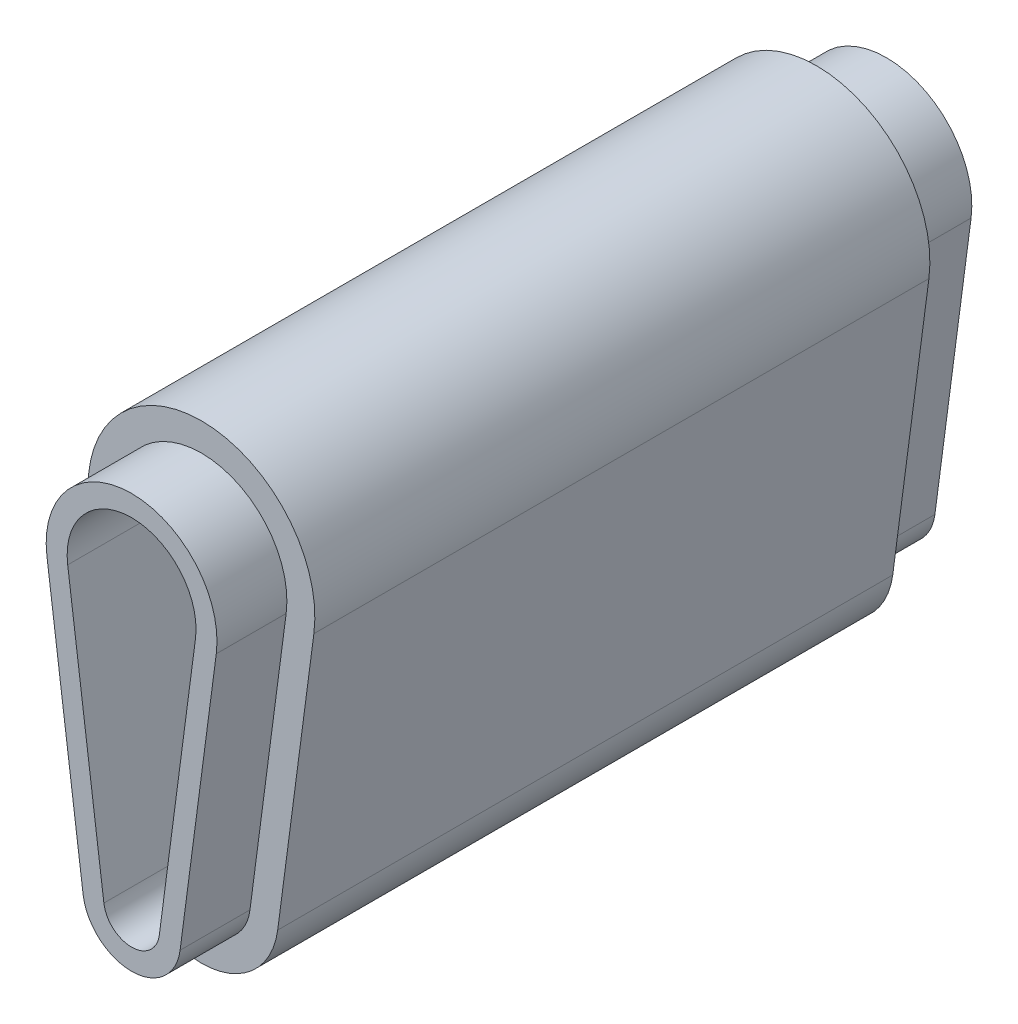
ISO-10303-21;
HEADER;
FILE_DESCRIPTION(('STEP AP214'),'2;1');
FILE_NAME('part.step','',(''),(''),'','','');
FILE_SCHEMA(('AUTOMOTIVE_DESIGN { 1 0 10303 214 1 1 1 1 }'));
ENDSEC;
DATA;
#1=APPLICATION_CONTEXT('core data for automotive mechanical design processes');
#2=APPLICATION_PROTOCOL_DEFINITION('international standard','automotive_design',2000,#1);
#3=PRODUCT_CONTEXT('',#1,'mechanical');
#4=PRODUCT('Part','Part','',(#3));
#5=PRODUCT_RELATED_PRODUCT_CATEGORY('part','',(#4));
#6=PRODUCT_DEFINITION_FORMATION('','',#4);
#7=PRODUCT_DEFINITION_CONTEXT('part definition',#1,'design');
#8=PRODUCT_DEFINITION('design','',#6,#7);
#9=PRODUCT_DEFINITION_SHAPE('','',#8);
#10=(LENGTH_UNIT() NAMED_UNIT(*) SI_UNIT(.MILLI.,.METRE.));
#11=(NAMED_UNIT(*) PLANE_ANGLE_UNIT() SI_UNIT($,.RADIAN.));
#12=(NAMED_UNIT(*) SI_UNIT($,.STERADIAN.) SOLID_ANGLE_UNIT());
#13=UNCERTAINTY_MEASURE_WITH_UNIT(LENGTH_MEASURE(1.E-05),#10,'distance_accuracy_value','');
#14=(GEOMETRIC_REPRESENTATION_CONTEXT(3) GLOBAL_UNCERTAINTY_ASSIGNED_CONTEXT((#13)) GLOBAL_UNIT_ASSIGNED_CONTEXT((#10,
#11,#12)) REPRESENTATION_CONTEXT('',''));
#15=CARTESIAN_POINT('',(0.,0.,0.));
#16=DIRECTION('',(0.,0.,1.));
#17=DIRECTION('',(1.,0.,0.));
#18=AXIS2_PLACEMENT_3D('',#15,#16,#17);
#19=CARTESIAN_POINT('',(0.,99.2950857179196,-22.));
#20=DIRECTION('',(0.,0.,-1.));
#21=DIRECTION('',(-1.,0.,0.));
#22=AXIS2_PLACEMENT_3D('',#19,#20,#21);
#23=PLANE('',#22);
#24=CARTESIAN_POINT('',(0.,99.2950857179196,-22.));
#25=DIRECTION('',(0.,0.,-1.));
#26=DIRECTION('',(-1.,0.,0.));
#27=AXIS2_PLACEMENT_3D('',#24,#25,#26);
#28=CIRCLE('',#27,2.75);
#29=CARTESIAN_POINT('',(2.72647336877798,98.9361386893145,-22.));
#30=VERTEX_POINT('',#29);
#31=CARTESIAN_POINT('',(-2.72647336877798,98.9361386893145,-22.));
#32=VERTEX_POINT('',#31);
#33=EDGE_CURVE('E204',#30,#32,#28,.T.);
#34=ORIENTED_EDGE('',*,*,#33,.T.);
#35=DIRECTION('',(-0.130526192220055,0.99144486137381,0.));
#36=VECTOR('',#35,1.);
#37=CARTESIAN_POINT('',(-2.72647336877798,98.9361386893145,-22.));
#38=LINE('',#37,#36);
#39=CARTESIAN_POINT('',(-4.02056859429062,108.76576782076,-22.));
#40=VERTEX_POINT('',#39);
#41=EDGE_CURVE('E207',#32,#40,#38,.T.);
#42=ORIENTED_EDGE('',*,*,#41,.T.);
#43=CARTESIAN_POINT('',(0.,109.29508571792,-22.));
#44=DIRECTION('',(0.,0.,-1.));
#45=DIRECTION('',(-1.,0.,0.));
#46=AXIS2_PLACEMENT_3D('',#43,#44,#45);
#47=CIRCLE('',#46,4.05526192220055);
#48=CARTESIAN_POINT('',(4.02056859429061,108.76576782076,-22.));
#49=VERTEX_POINT('',#48);
#50=EDGE_CURVE('E210',#40,#49,#47,.T.);
#51=ORIENTED_EDGE('',*,*,#50,.T.);
#52=DIRECTION('',(-0.130526192220055,-0.99144486137381,0.));
#53=VECTOR('',#52,1.);
#54=CARTESIAN_POINT('',(4.02056859429061,108.76576782076,-22.));
#55=LINE('',#54,#53);
#56=EDGE_CURVE('E212',#49,#30,#55,.T.);
#57=ORIENTED_EDGE('',*,*,#56,.T.);
#58=EDGE_LOOP('',(#34,#42,#51,#57));
#59=FACE_BOUND('',#58,.T.);
#60=CARTESIAN_POINT('',(0.,109.29508571792,-22.));
#61=DIRECTION('',(0.,0.,-1.));
#62=DIRECTION('',(-1.,0.,0.));
#63=AXIS2_PLACEMENT_3D('',#60,#61,#62);
#64=CIRCLE('',#63,3.05526192220055);
#65=CARTESIAN_POINT('',(-3.02912373291681,108.89629401298,-22.));
#66=VERTEX_POINT('',#65);
#67=CARTESIAN_POINT('',(3.0291237329168,108.89629401298,-22.));
#68=VERTEX_POINT('',#67);
#69=EDGE_CURVE('E190',#66,#68,#64,.T.);
#70=ORIENTED_EDGE('',*,*,#69,.F.);
#71=DIRECTION('',(-0.130526192220055,0.99144486137381,0.));
#72=VECTOR('',#71,1.);
#73=CARTESIAN_POINT('',(-1.73502850740417,99.0666648815345,-22.));
#74=LINE('',#73,#72);
#75=CARTESIAN_POINT('',(-1.73502850740417,99.0666648815345,-22.));
#76=VERTEX_POINT('',#75);
#77=EDGE_CURVE('E176',#76,#66,#74,.T.);
#78=ORIENTED_EDGE('',*,*,#77,.F.);
#79=CARTESIAN_POINT('',(0.,99.2950857179196,-22.));
#80=DIRECTION('',(0.,0.,-1.));
#81=DIRECTION('',(-1.,0.,0.));
#82=AXIS2_PLACEMENT_3D('',#79,#80,#81);
#83=CIRCLE('',#82,1.75);
#84=CARTESIAN_POINT('',(1.73502850740417,99.0666648815345,-22.));
#85=VERTEX_POINT('',#84);
#86=EDGE_CURVE('E181',#85,#76,#83,.T.);
#87=ORIENTED_EDGE('',*,*,#86,.F.);
#88=DIRECTION('',(-0.130526192220055,-0.99144486137381,0.));
#89=VECTOR('',#88,1.);
#90=CARTESIAN_POINT('',(1.73502850740417,99.0666648815345,-22.));
#91=LINE('',#90,#89);
#92=EDGE_CURVE('E192',#68,#85,#91,.T.);
#93=ORIENTED_EDGE('',*,*,#92,.F.);
#94=EDGE_LOOP('',(#70,#78,#87,#93));
#95=FACE_BOUND('',#94,.T.);
#96=ADVANCED_FACE('F32',(#59,#95),#23,.T.);
#97=CARTESIAN_POINT('',(0.,99.2950857179196,0.));
#98=DIRECTION('',(0.,0.,1.));
#99=DIRECTION('',(1.,0.,0.));
#100=AXIS2_PLACEMENT_3D('',#97,#98,#99);
#101=CYLINDRICAL_SURFACE('',#100,1.75);
#102=CARTESIAN_POINT('',(0.,99.2950857179196,2.5));
#103=DIRECTION('',(0.,0.,1.));
#104=DIRECTION('',(1.,0.,0.));
#105=AXIS2_PLACEMENT_3D('',#102,#103,#104);
#106=CIRCLE('',#105,1.75);
#107=CARTESIAN_POINT('',(-1.73502850740417,99.0666648815345,2.5));
#108=VERTEX_POINT('',#107);
#109=CARTESIAN_POINT('',(1.73502850740417,99.0666648815345,2.5));
#110=VERTEX_POINT('',#109);
#111=EDGE_CURVE('E241',#108,#110,#106,.T.);
#112=ORIENTED_EDGE('',*,*,#111,.F.);
#113=DIRECTION('',(0.,0.,1.));
#114=VECTOR('',#113,1.);
#115=CARTESIAN_POINT('',(-1.73502850740417,99.0666648815345,0.));
#116=LINE('',#115,#114);
#117=CARTESIAN_POINT('',(-1.73502850740417,99.0666648815345,0.));
#118=VERTEX_POINT('',#117);
#119=EDGE_CURVE('E11',#118,#108,#116,.T.);
#120=ORIENTED_EDGE('',*,*,#119,.F.);
#121=CARTESIAN_POINT('',(0.,99.2950857179196,0.));
#122=DIRECTION('',(0.,0.,1.));
#123=DIRECTION('',(1.,0.,0.));
#124=AXIS2_PLACEMENT_3D('',#121,#122,#123);
#125=CIRCLE('',#124,1.75);
#126=CARTESIAN_POINT('',(1.73502850740417,99.0666648815345,0.));
#127=VERTEX_POINT('',#126);
#128=EDGE_CURVE('E245',#118,#127,#125,.T.);
#129=ORIENTED_EDGE('',*,*,#128,.T.);
#130=DIRECTION('',(0.,0.,1.));
#131=VECTOR('',#130,1.);
#132=CARTESIAN_POINT('',(1.73502850740417,99.0666648815345,0.));
#133=LINE('',#132,#131);
#134=EDGE_CURVE('E36',#127,#110,#133,.T.);
#135=ORIENTED_EDGE('',*,*,#134,.T.);
#136=EDGE_LOOP('',(#112,#120,#129,#135));
#137=FACE_BOUND('',#136,.T.);
#138=ADVANCED_FACE('F34',(#137),#101,.T.);
#139=CARTESIAN_POINT('',(-3.02912373291681,108.89629401298,0.));
#140=DIRECTION('',(-0.99144486137381,-0.130526192220055,0.));
#141=DIRECTION('',(0.130526192220055,-0.99144486137381,0.));
#142=AXIS2_PLACEMENT_3D('',#139,#140,#141);
#143=PLANE('',#142);
#144=DIRECTION('',(0.130526192220055,-0.99144486137381,0.));
#145=VECTOR('',#144,1.);
#146=CARTESIAN_POINT('',(-3.02912373291681,108.89629401298,2.5));
#147=LINE('',#146,#145);
#148=CARTESIAN_POINT('',(-3.02912373291681,108.89629401298,2.5));
#149=VERTEX_POINT('',#148);
#150=EDGE_CURVE('E249',#149,#108,#147,.T.);
#151=ORIENTED_EDGE('',*,*,#150,.F.);
#152=DIRECTION('',(0.,0.,1.));
#153=VECTOR('',#152,1.);
#154=CARTESIAN_POINT('',(-3.02912373291681,108.89629401298,0.));
#155=LINE('',#154,#153);
#156=CARTESIAN_POINT('',(-3.02912373291681,108.89629401298,0.));
#157=VERTEX_POINT('',#156);
#158=EDGE_CURVE('E41',#157,#149,#155,.T.);
#159=ORIENTED_EDGE('',*,*,#158,.F.);
#160=DIRECTION('',(0.130526192220055,-0.99144486137381,0.));
#161=VECTOR('',#160,1.);
#162=CARTESIAN_POINT('',(-3.02912373291681,108.89629401298,0.));
#163=LINE('',#162,#161);
#164=EDGE_CURVE('E255',#157,#118,#163,.T.);
#165=ORIENTED_EDGE('',*,*,#164,.T.);
#166=ORIENTED_EDGE('',*,*,#119,.T.);
#167=EDGE_LOOP('',(#151,#159,#165,#166));
#168=FACE_BOUND('',#167,.T.);
#169=ADVANCED_FACE('F283',(#168),#143,.T.);
#170=CARTESIAN_POINT('',(0.,109.29508571792,0.));
#171=DIRECTION('',(0.,0.,1.));
#172=DIRECTION('',(1.,0.,0.));
#173=AXIS2_PLACEMENT_3D('',#170,#171,#172);
#174=CYLINDRICAL_SURFACE('',#173,3.05526192220055);
#175=CARTESIAN_POINT('',(0.,109.29508571792,2.5));
#176=DIRECTION('',(0.,0.,1.));
#177=DIRECTION('',(1.,0.,0.));
#178=AXIS2_PLACEMENT_3D('',#175,#176,#177);
#179=CIRCLE('',#178,3.05526192220055);
#180=CARTESIAN_POINT('',(3.0291237329168,108.89629401298,2.5));
#181=VERTEX_POINT('',#180);
#182=EDGE_CURVE('E263',#181,#149,#179,.T.);
#183=ORIENTED_EDGE('',*,*,#182,.F.);
#184=DIRECTION('',(0.,0.,1.));
#185=VECTOR('',#184,1.);
#186=CARTESIAN_POINT('',(3.0291237329168,108.89629401298,0.));
#187=LINE('',#186,#185);
#188=CARTESIAN_POINT('',(3.0291237329168,108.89629401298,0.));
#189=VERTEX_POINT('',#188);
#190=EDGE_CURVE('E268',#189,#181,#187,.T.);
#191=ORIENTED_EDGE('',*,*,#190,.F.);
#192=CARTESIAN_POINT('',(0.,109.29508571792,0.));
#193=DIRECTION('',(0.,0.,1.));
#194=DIRECTION('',(1.,0.,0.));
#195=AXIS2_PLACEMENT_3D('',#192,#193,#194);
#196=CIRCLE('',#195,3.05526192220055);
#197=EDGE_CURVE('E252',#189,#157,#196,.T.);
#198=ORIENTED_EDGE('',*,*,#197,.T.);
#199=ORIENTED_EDGE('',*,*,#158,.T.);
#200=EDGE_LOOP('',(#183,#191,#198,#199));
#201=FACE_BOUND('',#200,.T.);
#202=ADVANCED_FACE('F288',(#201),#174,.T.);
#203=CARTESIAN_POINT('',(1.73502850740417,99.0666648815345,0.));
#204=DIRECTION('',(0.99144486137381,-0.130526192220055,0.));
#205=DIRECTION('',(0.130526192220055,0.99144486137381,0.));
#206=AXIS2_PLACEMENT_3D('',#203,#204,#205);
#207=PLANE('',#206);
#208=DIRECTION('',(0.130526192220055,0.99144486137381,0.));
#209=VECTOR('',#208,1.);
#210=CARTESIAN_POINT('',(1.73502850740417,99.0666648815345,2.5));
#211=LINE('',#210,#209);
#212=EDGE_CURVE('E260',#110,#181,#211,.T.);
#213=ORIENTED_EDGE('',*,*,#212,.F.);
#214=ORIENTED_EDGE('',*,*,#134,.F.);
#215=DIRECTION('',(0.130526192220055,0.99144486137381,0.));
#216=VECTOR('',#215,1.);
#217=CARTESIAN_POINT('',(1.73502850740417,99.0666648815345,0.));
#218=LINE('',#217,#216);
#219=EDGE_CURVE('E248',#127,#189,#218,.T.);
#220=ORIENTED_EDGE('',*,*,#219,.T.);
#221=ORIENTED_EDGE('',*,*,#190,.T.);
#222=EDGE_LOOP('',(#213,#214,#220,#221));
#223=FACE_BOUND('',#222,.T.);
#224=ADVANCED_FACE('F277',(#223),#207,.T.);
#225=CARTESIAN_POINT('',(0.,99.2950857179196,2.5));
#226=DIRECTION('',(0.,0.,1.));
#227=DIRECTION('',(1.,0.,0.));
#228=AXIS2_PLACEMENT_3D('',#225,#226,#227);
#229=PLANE('',#228);
#230=CARTESIAN_POINT('',(0.,99.2950857179196,2.5));
#231=DIRECTION('',(0.,0.,1.));
#232=DIRECTION('',(1.,0.,0.));
#233=AXIS2_PLACEMENT_3D('',#230,#231,#232);
#234=CIRCLE('',#233,0.999999999999999);
#235=CARTESIAN_POINT('',(-0.991444861373811,99.1645595256996,2.5));
#236=VERTEX_POINT('',#235);
#237=CARTESIAN_POINT('',(0.991444861373807,99.1645595256996,2.5));
#238=VERTEX_POINT('',#237);
#239=EDGE_CURVE('E57',#236,#238,#234,.T.);
#240=ORIENTED_EDGE('',*,*,#239,.F.);
#241=DIRECTION('',(0.130526192220055,-0.99144486137381,0.));
#242=VECTOR('',#241,1.);
#243=CARTESIAN_POINT('',(-2.28554008688645,108.994188657145,2.5));
#244=LINE('',#243,#242);
#245=CARTESIAN_POINT('',(-2.28554008688645,108.994188657145,2.5));
#246=VERTEX_POINT('',#245);
#247=EDGE_CURVE('E238',#246,#236,#244,.T.);
#248=ORIENTED_EDGE('',*,*,#247,.F.);
#249=CARTESIAN_POINT('',(0.,109.29508571792,2.5));
#250=DIRECTION('',(0.,0.,1.));
#251=DIRECTION('',(1.,0.,0.));
#252=AXIS2_PLACEMENT_3D('',#249,#250,#251);
#253=CIRCLE('',#252,2.30526192220055);
#254=CARTESIAN_POINT('',(2.28554008688644,108.994188657145,2.5));
#255=VERTEX_POINT('',#254);
#256=EDGE_CURVE('E154',#255,#246,#253,.T.);
#257=ORIENTED_EDGE('',*,*,#256,.F.);
#258=DIRECTION('',(0.130526192220055,0.99144486137381,0.));
#259=VECTOR('',#258,1.);
#260=CARTESIAN_POINT('',(0.991444861373808,99.1645595256996,2.5));
#261=LINE('',#260,#259);
#262=EDGE_CURVE('E234',#238,#255,#261,.T.);
#263=ORIENTED_EDGE('',*,*,#262,.F.);
#264=EDGE_LOOP('',(#240,#248,#257,#263));
#265=FACE_BOUND('',#264,.T.);
#266=ORIENTED_EDGE('',*,*,#111,.T.);
#267=ORIENTED_EDGE('',*,*,#212,.T.);
#268=ORIENTED_EDGE('',*,*,#182,.T.);
#269=ORIENTED_EDGE('',*,*,#150,.T.);
#270=EDGE_LOOP('',(#266,#267,#268,#269));
#271=FACE_BOUND('',#270,.T.);
#272=ADVANCED_FACE('F279',(#265,#271),#229,.T.);
#273=CARTESIAN_POINT('',(0.,99.2950857179196,0.));
#274=DIRECTION('',(0.,0.,1.));
#275=DIRECTION('',(1.,0.,0.));
#276=AXIS2_PLACEMENT_3D('',#273,#274,#275);
#277=CYLINDRICAL_SURFACE('',#276,0.999999999999999);
#278=ORIENTED_EDGE('',*,*,#239,.T.);
#279=DIRECTION('',(0.,0.,1.));
#280=VECTOR('',#279,1.);
#281=CARTESIAN_POINT('',(0.991444861373808,99.1645595256996,0.));
#282=LINE('',#281,#280);
#283=CARTESIAN_POINT('',(0.991444861373808,99.1645595256996,-24.5));
#284=VERTEX_POINT('',#283);
#285=EDGE_CURVE('E240',#284,#238,#282,.T.);
#286=ORIENTED_EDGE('',*,*,#285,.F.);
#287=CARTESIAN_POINT('',(0.,99.2950857179196,-24.5));
#288=DIRECTION('',(0.,0.,-1.));
#289=DIRECTION('',(-1.,0.,0.));
#290=AXIS2_PLACEMENT_3D('',#287,#288,#289);
#291=CIRCLE('',#290,0.999999999999999);
#292=CARTESIAN_POINT('',(-0.99144486137381,99.1645595256996,-24.5));
#293=VERTEX_POINT('',#292);
#294=EDGE_CURVE('E172',#284,#293,#291,.T.);
#295=ORIENTED_EDGE('',*,*,#294,.T.);
#296=DIRECTION('',(0.,0.,1.));
#297=VECTOR('',#296,1.);
#298=CARTESIAN_POINT('',(-0.991444861373811,99.1645595256996,0.));
#299=LINE('',#298,#297);
#300=EDGE_CURVE('E158',#293,#236,#299,.T.);
#301=ORIENTED_EDGE('',*,*,#300,.T.);
#302=EDGE_LOOP('',(#278,#286,#295,#301));
#303=FACE_BOUND('',#302,.T.);
#304=ADVANCED_FACE('F328',(#303),#277,.F.);
#305=CARTESIAN_POINT('',(-2.28554008688645,108.994188657145,0.));
#306=DIRECTION('',(-0.99144486137381,-0.130526192220055,0.));
#307=DIRECTION('',(0.130526192220055,-0.99144486137381,0.));
#308=AXIS2_PLACEMENT_3D('',#305,#306,#307);
#309=PLANE('',#308);
#310=ORIENTED_EDGE('',*,*,#247,.T.);
#311=ORIENTED_EDGE('',*,*,#300,.F.);
#312=DIRECTION('',(-0.130526192220055,0.99144486137381,0.));
#313=VECTOR('',#312,1.);
#314=CARTESIAN_POINT('',(-0.99144486137381,99.1645595256996,-24.5));
#315=LINE('',#314,#313);
#316=CARTESIAN_POINT('',(-2.28554008688645,108.994188657145,-24.5));
#317=VERTEX_POINT('',#316);
#318=EDGE_CURVE('E162',#293,#317,#315,.T.);
#319=ORIENTED_EDGE('',*,*,#318,.T.);
#320=DIRECTION('',(0.,0.,1.));
#321=VECTOR('',#320,1.);
#322=CARTESIAN_POINT('',(-2.28554008688645,108.994188657145,0.));
#323=LINE('',#322,#321);
#324=EDGE_CURVE('E147',#317,#246,#323,.T.);
#325=ORIENTED_EDGE('',*,*,#324,.T.);
#326=EDGE_LOOP('',(#310,#311,#319,#325));
#327=FACE_BOUND('',#326,.T.);
#328=ADVANCED_FACE('F163',(#327),#309,.F.);
#329=CARTESIAN_POINT('',(0.,109.29508571792,0.));
#330=DIRECTION('',(0.,0.,1.));
#331=DIRECTION('',(1.,0.,0.));
#332=AXIS2_PLACEMENT_3D('',#329,#330,#331);
#333=CYLINDRICAL_SURFACE('',#332,2.30526192220055);
#334=ORIENTED_EDGE('',*,*,#256,.T.);
#335=ORIENTED_EDGE('',*,*,#324,.F.);
#336=CARTESIAN_POINT('',(0.,109.29508571792,-24.5));
#337=DIRECTION('',(0.,0.,-1.));
#338=DIRECTION('',(-1.,0.,0.));
#339=AXIS2_PLACEMENT_3D('',#336,#337,#338);
#340=CIRCLE('',#339,2.30526192220055);
#341=CARTESIAN_POINT('',(2.28554008688644,108.994188657145,-24.5));
#342=VERTEX_POINT('',#341);
#343=EDGE_CURVE('E151',#317,#342,#340,.T.);
#344=ORIENTED_EDGE('',*,*,#343,.T.);
#345=DIRECTION('',(0.,0.,1.));
#346=VECTOR('',#345,1.);
#347=CARTESIAN_POINT('',(2.28554008688644,108.994188657145,0.));
#348=LINE('',#347,#346);
#349=EDGE_CURVE('E159',#342,#255,#348,.T.);
#350=ORIENTED_EDGE('',*,*,#349,.T.);
#351=EDGE_LOOP('',(#334,#335,#344,#350));
#352=FACE_BOUND('',#351,.T.);
#353=ADVANCED_FACE('F149',(#352),#333,.F.);
#354=CARTESIAN_POINT('',(0.991444861373808,99.1645595256996,0.));
#355=DIRECTION('',(0.99144486137381,-0.130526192220055,0.));
#356=DIRECTION('',(0.130526192220055,0.99144486137381,0.));
#357=AXIS2_PLACEMENT_3D('',#354,#355,#356);
#358=PLANE('',#357);
#359=ORIENTED_EDGE('',*,*,#262,.T.);
#360=ORIENTED_EDGE('',*,*,#349,.F.);
#361=DIRECTION('',(-0.130526192220055,-0.99144486137381,0.));
#362=VECTOR('',#361,1.);
#363=CARTESIAN_POINT('',(0.991444861373807,99.1645595256996,-24.5));
#364=LINE('',#363,#362);
#365=EDGE_CURVE('E170',#342,#284,#364,.T.);
#366=ORIENTED_EDGE('',*,*,#365,.T.);
#367=ORIENTED_EDGE('',*,*,#285,.T.);
#368=EDGE_LOOP('',(#359,#360,#366,#367));
#369=FACE_BOUND('',#368,.T.);
#370=ADVANCED_FACE('F310',(#369),#358,.F.);
#371=CARTESIAN_POINT('',(0.,99.2950857179196,0.));
#372=DIRECTION('',(0.,0.,-1.));
#373=DIRECTION('',(-1.,0.,0.));
#374=AXIS2_PLACEMENT_3D('',#371,#372,#373);
#375=PLANE('',#374);
#376=ORIENTED_EDGE('',*,*,#128,.F.);
#377=ORIENTED_EDGE('',*,*,#164,.F.);
#378=ORIENTED_EDGE('',*,*,#197,.F.);
#379=ORIENTED_EDGE('',*,*,#219,.F.);
#380=EDGE_LOOP('',(#376,#377,#378,#379));
#381=FACE_BOUND('',#380,.T.);
#382=CARTESIAN_POINT('',(0.,99.2950857179196,0.));
#383=DIRECTION('',(0.,0.,-1.));
#384=DIRECTION('',(-1.,0.,0.));
#385=AXIS2_PLACEMENT_3D('',#382,#383,#384);
#386=CIRCLE('',#385,2.75);
#387=CARTESIAN_POINT('',(2.72647336877798,98.9361386893145,0.));
#388=VERTEX_POINT('',#387);
#389=CARTESIAN_POINT('',(-2.72647336877798,98.9361386893145,0.));
#390=VERTEX_POINT('',#389);
#391=EDGE_CURVE('E203',#388,#390,#386,.T.);
#392=ORIENTED_EDGE('',*,*,#391,.F.);
#393=DIRECTION('',(-0.130526192220055,-0.99144486137381,0.));
#394=VECTOR('',#393,1.);
#395=CARTESIAN_POINT('',(4.02056859429061,108.76576782076,0.));
#396=LINE('',#395,#394);
#397=CARTESIAN_POINT('',(4.02056859429061,108.76576782076,0.));
#398=VERTEX_POINT('',#397);
#399=EDGE_CURVE('E208',#398,#388,#396,.T.);
#400=ORIENTED_EDGE('',*,*,#399,.F.);
#401=CARTESIAN_POINT('',(0.,109.29508571792,0.));
#402=DIRECTION('',(0.,0.,-1.));
#403=DIRECTION('',(-1.,0.,0.));
#404=AXIS2_PLACEMENT_3D('',#401,#402,#403);
#405=CIRCLE('',#404,4.05526192220055);
#406=CARTESIAN_POINT('',(-4.02056859429062,108.76576782076,0.));
#407=VERTEX_POINT('',#406);
#408=EDGE_CURVE('E219',#407,#398,#405,.T.);
#409=ORIENTED_EDGE('',*,*,#408,.F.);
#410=DIRECTION('',(-0.130526192220055,0.99144486137381,0.));
#411=VECTOR('',#410,1.);
#412=CARTESIAN_POINT('',(-2.72647336877798,98.9361386893145,0.));
#413=LINE('',#412,#411);
#414=EDGE_CURVE('E217',#390,#407,#413,.T.);
#415=ORIENTED_EDGE('',*,*,#414,.F.);
#416=EDGE_LOOP('',(#392,#400,#409,#415));
#417=FACE_BOUND('',#416,.T.);
#418=ADVANCED_FACE('F285',(#381,#417),#375,.F.);
#419=CARTESIAN_POINT('',(0.,99.2950857179196,-22.));
#420=DIRECTION('',(0.,0.,1.));
#421=DIRECTION('',(1.,0.,0.));
#422=AXIS2_PLACEMENT_3D('',#419,#420,#421);
#423=CYLINDRICAL_SURFACE('',#422,2.75);
#424=ORIENTED_EDGE('',*,*,#391,.T.);
#425=DIRECTION('',(0.,0.,1.));
#426=VECTOR('',#425,1.);
#427=CARTESIAN_POINT('',(-2.72647336877798,98.9361386893145,-22.));
#428=LINE('',#427,#426);
#429=EDGE_CURVE('E230',#32,#390,#428,.T.);
#430=ORIENTED_EDGE('',*,*,#429,.F.);
#431=ORIENTED_EDGE('',*,*,#33,.F.);
#432=DIRECTION('',(0.,0.,1.));
#433=VECTOR('',#432,1.);
#434=CARTESIAN_POINT('',(2.72647336877798,98.9361386893145,-22.));
#435=LINE('',#434,#433);
#436=EDGE_CURVE('E214',#30,#388,#435,.T.);
#437=ORIENTED_EDGE('',*,*,#436,.T.);
#438=EDGE_LOOP('',(#424,#430,#431,#437));
#439=FACE_BOUND('',#438,.T.);
#440=ADVANCED_FACE('F309',(#439),#423,.T.);
#441=CARTESIAN_POINT('',(-2.72647336877798,98.9361386893145,-22.));
#442=DIRECTION('',(0.99144486137381,0.130526192220055,0.));
#443=DIRECTION('',(-0.130526192220055,0.99144486137381,0.));
#444=AXIS2_PLACEMENT_3D('',#441,#442,#443);
#445=PLANE('',#444);
#446=ORIENTED_EDGE('',*,*,#414,.T.);
#447=DIRECTION('',(0.,0.,1.));
#448=VECTOR('',#447,1.);
#449=CARTESIAN_POINT('',(-4.02056859429062,108.76576782076,-22.));
#450=LINE('',#449,#448);
#451=EDGE_CURVE('E227',#40,#407,#450,.T.);
#452=ORIENTED_EDGE('',*,*,#451,.F.);
#453=ORIENTED_EDGE('',*,*,#41,.F.);
#454=ORIENTED_EDGE('',*,*,#429,.T.);
#455=EDGE_LOOP('',(#446,#452,#453,#454));
#456=FACE_BOUND('',#455,.T.);
#457=ADVANCED_FACE('F318',(#456),#445,.F.);
#458=CARTESIAN_POINT('',(0.,109.29508571792,-22.));
#459=DIRECTION('',(0.,0.,1.));
#460=DIRECTION('',(1.,0.,0.));
#461=AXIS2_PLACEMENT_3D('',#458,#459,#460);
#462=CYLINDRICAL_SURFACE('',#461,4.05526192220055);
#463=ORIENTED_EDGE('',*,*,#408,.T.);
#464=DIRECTION('',(0.,0.,1.));
#465=VECTOR('',#464,1.);
#466=CARTESIAN_POINT('',(4.02056859429061,108.76576782076,-22.));
#467=LINE('',#466,#465);
#468=EDGE_CURVE('E224',#49,#398,#467,.T.);
#469=ORIENTED_EDGE('',*,*,#468,.F.);
#470=ORIENTED_EDGE('',*,*,#50,.F.);
#471=ORIENTED_EDGE('',*,*,#451,.T.);
#472=EDGE_LOOP('',(#463,#469,#470,#471));
#473=FACE_BOUND('',#472,.T.);
#474=ADVANCED_FACE('F314',(#473),#462,.T.);
#475=CARTESIAN_POINT('',(4.02056859429061,108.76576782076,-22.));
#476=DIRECTION('',(-0.99144486137381,0.130526192220055,0.));
#477=DIRECTION('',(-0.130526192220055,-0.99144486137381,0.));
#478=AXIS2_PLACEMENT_3D('',#475,#476,#477);
#479=PLANE('',#478);
#480=ORIENTED_EDGE('',*,*,#399,.T.);
#481=ORIENTED_EDGE('',*,*,#436,.F.);
#482=ORIENTED_EDGE('',*,*,#56,.F.);
#483=ORIENTED_EDGE('',*,*,#468,.T.);
#484=EDGE_LOOP('',(#480,#481,#482,#483));
#485=FACE_BOUND('',#484,.T.);
#486=ADVANCED_FACE('F311',(#485),#479,.F.);
#487=CARTESIAN_POINT('',(0.,109.29508571792,-24.5));
#488=DIRECTION('',(0.,0.,-1.));
#489=DIRECTION('',(-1.,0.,0.));
#490=AXIS2_PLACEMENT_3D('',#487,#488,#489);
#491=PLANE('',#490);
#492=DIRECTION('',(-0.130526192220055,0.99144486137381,0.));
#493=VECTOR('',#492,1.);
#494=CARTESIAN_POINT('',(-1.73502850740417,99.0666648815345,-24.5));
#495=LINE('',#494,#493);
#496=CARTESIAN_POINT('',(-1.73502850740417,99.0666648815345,-24.5));
#497=VERTEX_POINT('',#496);
#498=CARTESIAN_POINT('',(-3.02912373291681,108.89629401298,-24.5));
#499=VERTEX_POINT('',#498);
#500=EDGE_CURVE('E177',#497,#499,#495,.T.);
#501=ORIENTED_EDGE('',*,*,#500,.T.);
#502=CARTESIAN_POINT('',(0.,109.29508571792,-24.5));
#503=DIRECTION('',(0.,0.,-1.));
#504=DIRECTION('',(-1.,0.,0.));
#505=AXIS2_PLACEMENT_3D('',#502,#503,#504);
#506=CIRCLE('',#505,3.05526192220055);
#507=CARTESIAN_POINT('',(3.0291237329168,108.89629401298,-24.5));
#508=VERTEX_POINT('',#507);
#509=EDGE_CURVE('E180',#499,#508,#506,.T.);
#510=ORIENTED_EDGE('',*,*,#509,.T.);
#511=DIRECTION('',(-0.130526192220055,-0.99144486137381,0.));
#512=VECTOR('',#511,1.);
#513=CARTESIAN_POINT('',(1.73502850740417,99.0666648815345,-24.5));
#514=LINE('',#513,#512);
#515=CARTESIAN_POINT('',(1.73502850740417,99.0666648815345,-24.5));
#516=VERTEX_POINT('',#515);
#517=EDGE_CURVE('E183',#508,#516,#514,.T.);
#518=ORIENTED_EDGE('',*,*,#517,.T.);
#519=CARTESIAN_POINT('',(0.,99.2950857179196,-24.5));
#520=DIRECTION('',(0.,0.,-1.));
#521=DIRECTION('',(-1.,0.,0.));
#522=AXIS2_PLACEMENT_3D('',#519,#520,#521);
#523=CIRCLE('',#522,1.75);
#524=EDGE_CURVE('E185',#516,#497,#523,.T.);
#525=ORIENTED_EDGE('',*,*,#524,.T.);
#526=EDGE_LOOP('',(#501,#510,#518,#525));
#527=FACE_BOUND('',#526,.T.);
#528=ORIENTED_EDGE('',*,*,#343,.F.);
#529=ORIENTED_EDGE('',*,*,#318,.F.);
#530=ORIENTED_EDGE('',*,*,#294,.F.);
#531=ORIENTED_EDGE('',*,*,#365,.F.);
#532=EDGE_LOOP('',(#528,#529,#530,#531));
#533=FACE_BOUND('',#532,.T.);
#534=ADVANCED_FACE('F168',(#527,#533),#491,.T.);
#535=CARTESIAN_POINT('',(-1.73502850740417,99.0666648815345,-24.5));
#536=DIRECTION('',(0.99144486137381,0.130526192220055,0.));
#537=DIRECTION('',(-0.130526192220055,0.99144486137381,0.));
#538=AXIS2_PLACEMENT_3D('',#535,#536,#537);
#539=PLANE('',#538);
#540=ORIENTED_EDGE('',*,*,#77,.T.);
#541=DIRECTION('',(0.,0.,1.));
#542=VECTOR('',#541,1.);
#543=CARTESIAN_POINT('',(-3.02912373291681,108.89629401298,-24.5));
#544=LINE('',#543,#542);
#545=EDGE_CURVE('E201',#499,#66,#544,.T.);
#546=ORIENTED_EDGE('',*,*,#545,.F.);
#547=ORIENTED_EDGE('',*,*,#500,.F.);
#548=DIRECTION('',(0.,0.,1.));
#549=VECTOR('',#548,1.);
#550=CARTESIAN_POINT('',(-1.73502850740417,99.0666648815345,-24.5));
#551=LINE('',#550,#549);
#552=EDGE_CURVE('E187',#497,#76,#551,.T.);
#553=ORIENTED_EDGE('',*,*,#552,.T.);
#554=EDGE_LOOP('',(#540,#546,#547,#553));
#555=FACE_BOUND('',#554,.T.);
#556=ADVANCED_FACE('F305',(#555),#539,.F.);
#557=CARTESIAN_POINT('',(0.,109.29508571792,-24.5));
#558=DIRECTION('',(0.,0.,1.));
#559=DIRECTION('',(1.,0.,0.));
#560=AXIS2_PLACEMENT_3D('',#557,#558,#559);
#561=CYLINDRICAL_SURFACE('',#560,3.05526192220055);
#562=ORIENTED_EDGE('',*,*,#69,.T.);
#563=DIRECTION('',(0.,0.,1.));
#564=VECTOR('',#563,1.);
#565=CARTESIAN_POINT('',(3.0291237329168,108.89629401298,-24.5));
#566=LINE('',#565,#564);
#567=EDGE_CURVE('E198',#508,#68,#566,.T.);
#568=ORIENTED_EDGE('',*,*,#567,.F.);
#569=ORIENTED_EDGE('',*,*,#509,.F.);
#570=ORIENTED_EDGE('',*,*,#545,.T.);
#571=EDGE_LOOP('',(#562,#568,#569,#570));
#572=FACE_BOUND('',#571,.T.);
#573=ADVANCED_FACE('F407',(#572),#561,.T.);
#574=CARTESIAN_POINT('',(1.73502850740417,99.0666648815345,-24.5));
#575=DIRECTION('',(-0.99144486137381,0.130526192220055,0.));
#576=DIRECTION('',(-0.130526192220055,-0.99144486137381,0.));
#577=AXIS2_PLACEMENT_3D('',#574,#575,#576);
#578=PLANE('',#577);
#579=ORIENTED_EDGE('',*,*,#92,.T.);
#580=DIRECTION('',(0.,0.,1.));
#581=VECTOR('',#580,1.);
#582=CARTESIAN_POINT('',(1.73502850740417,99.0666648815345,-24.5));
#583=LINE('',#582,#581);
#584=EDGE_CURVE('E49',#516,#85,#583,.T.);
#585=ORIENTED_EDGE('',*,*,#584,.F.);
#586=ORIENTED_EDGE('',*,*,#517,.F.);
#587=ORIENTED_EDGE('',*,*,#567,.T.);
#588=EDGE_LOOP('',(#579,#585,#586,#587));
#589=FACE_BOUND('',#588,.T.);
#590=ADVANCED_FACE('F415',(#589),#578,.F.);
#591=CARTESIAN_POINT('',(0.,99.2950857179196,-24.5));
#592=DIRECTION('',(0.,0.,1.));
#593=DIRECTION('',(1.,0.,0.));
#594=AXIS2_PLACEMENT_3D('',#591,#592,#593);
#595=CYLINDRICAL_SURFACE('',#594,1.75);
#596=ORIENTED_EDGE('',*,*,#86,.T.);
#597=ORIENTED_EDGE('',*,*,#552,.F.);
#598=ORIENTED_EDGE('',*,*,#524,.F.);
#599=ORIENTED_EDGE('',*,*,#584,.T.);
#600=EDGE_LOOP('',(#596,#597,#598,#599));
#601=FACE_BOUND('',#600,.T.);
#602=ADVANCED_FACE('F423',(#601),#595,.T.);
#603=CLOSED_SHELL('',(#96,#138,#169,#202,#224,#272,#304,#328,#353,#370,#418,#440,#457,#474,#486,
#534,#556,#573,#590,#602));
#604=MANIFOLD_SOLID_BREP('B2',#603);
#605=ADVANCED_BREP_SHAPE_REPRESENTATION('',(#18,#604),#14);
#606=SHAPE_DEFINITION_REPRESENTATION(#9,#605);
ENDSEC;
END-ISO-10303-21;
